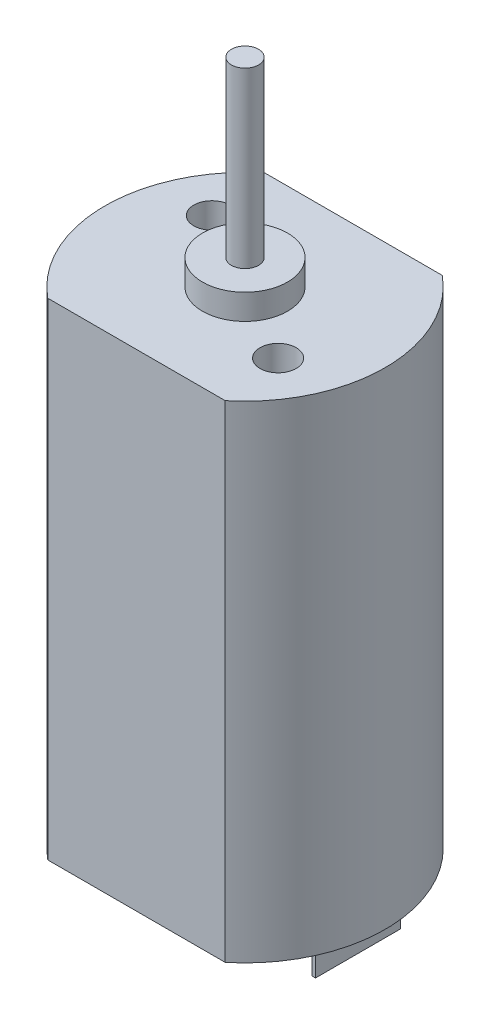
ISO-10303-21;
HEADER;
FILE_DESCRIPTION(('STEP AP214'),'2;1');
FILE_NAME('part.step','',(''),(''),'','','');
FILE_SCHEMA(('AUTOMOTIVE_DESIGN { 1 0 10303 214 1 1 1 1 }'));
ENDSEC;
DATA;
#1=APPLICATION_CONTEXT('core data for automotive mechanical design processes');
#2=APPLICATION_PROTOCOL_DEFINITION('international standard','automotive_design',2000,#1);
#3=PRODUCT_CONTEXT('',#1,'mechanical');
#4=PRODUCT('Part','Part','',(#3));
#5=PRODUCT_RELATED_PRODUCT_CATEGORY('part','',(#4));
#6=PRODUCT_DEFINITION_FORMATION('','',#4);
#7=PRODUCT_DEFINITION_CONTEXT('part definition',#1,'design');
#8=PRODUCT_DEFINITION('design','',#6,#7);
#9=PRODUCT_DEFINITION_SHAPE('','',#8);
#10=(LENGTH_UNIT() NAMED_UNIT(*) SI_UNIT(.MILLI.,.METRE.));
#11=(NAMED_UNIT(*) PLANE_ANGLE_UNIT() SI_UNIT($,.RADIAN.));
#12=(NAMED_UNIT(*) SI_UNIT($,.STERADIAN.) SOLID_ANGLE_UNIT());
#13=UNCERTAINTY_MEASURE_WITH_UNIT(LENGTH_MEASURE(1.E-05),#10,'distance_accuracy_value','');
#14=(GEOMETRIC_REPRESENTATION_CONTEXT(3) GLOBAL_UNCERTAINTY_ASSIGNED_CONTEXT((#13)) GLOBAL_UNIT_ASSIGNED_CONTEXT((#10,
#11,#12)) REPRESENTATION_CONTEXT('',''));
#15=CARTESIAN_POINT('',(0.,0.,0.));
#16=DIRECTION('',(0.,0.,1.));
#17=DIRECTION('',(1.,0.,0.));
#18=AXIS2_PLACEMENT_3D('',#15,#16,#17);
#19=CARTESIAN_POINT('',(0.,-13.45,0.));
#20=DIRECTION('',(0.,1.,0.));
#21=DIRECTION('',(0.,0.,1.));
#22=AXIS2_PLACEMENT_3D('',#19,#20,#21);
#23=PLANE('',#22);
#24=DIRECTION('',(0.,0.,-1.));
#25=VECTOR('',#24,1.);
#26=CARTESIAN_POINT('',(-6.25,-13.45,2.35));
#27=LINE('',#26,#25);
#28=CARTESIAN_POINT('',(-6.25,-13.45,2.35));
#29=VERTEX_POINT('',#28);
#30=CARTESIAN_POINT('',(-6.25,-13.45,-2.35));
#31=VERTEX_POINT('',#30);
#32=EDGE_CURVE('E142',#29,#31,#27,.T.);
#33=ORIENTED_EDGE('',*,*,#32,.F.);
#34=DIRECTION('',(-1.,0.,0.));
#35=VECTOR('',#34,1.);
#36=CARTESIAN_POINT('',(-6.25,-13.45,2.35));
#37=LINE('',#36,#35);
#38=CARTESIAN_POINT('',(-6.05,-13.45,2.35));
#39=VERTEX_POINT('',#38);
#40=EDGE_CURVE('E155',#39,#29,#37,.T.);
#41=ORIENTED_EDGE('',*,*,#40,.F.);
#42=DIRECTION('',(0.,0.,1.));
#43=VECTOR('',#42,1.);
#44=CARTESIAN_POINT('',(-6.05,-13.45,2.35));
#45=LINE('',#44,#43);
#46=CARTESIAN_POINT('',(-6.05,-13.45,-2.35));
#47=VERTEX_POINT('',#46);
#48=EDGE_CURVE('E164',#47,#39,#45,.T.);
#49=ORIENTED_EDGE('',*,*,#48,.F.);
#50=DIRECTION('',(1.,0.,0.));
#51=VECTOR('',#50,1.);
#52=CARTESIAN_POINT('',(-6.25,-13.45,-2.35));
#53=LINE('',#52,#51);
#54=EDGE_CURVE('E145',#31,#47,#53,.T.);
#55=ORIENTED_EDGE('',*,*,#54,.F.);
#56=EDGE_LOOP('',(#33,#41,#49,#55));
#57=FACE_BOUND('',#56,.T.);
#58=CARTESIAN_POINT('',(0.,-13.45,0.));
#59=DIRECTION('',(0.,1.,0.));
#60=DIRECTION('',(0.,0.,1.));
#61=AXIS2_PLACEMENT_3D('',#58,#59,#60);
#62=CIRCLE('',#61,7.75);
#63=CARTESIAN_POINT('',(4.90535421758714,-13.45,6.));
#64=VERTEX_POINT('',#63);
#65=CARTESIAN_POINT('',(4.90535421758714,-13.45,-6.));
#66=VERTEX_POINT('',#65);
#67=EDGE_CURVE('E190',#64,#66,#62,.T.);
#68=ORIENTED_EDGE('',*,*,#67,.F.);
#69=DIRECTION('',(1.,0.,0.));
#70=VECTOR('',#69,1.);
#71=CARTESIAN_POINT('',(4.90535421758714,-13.45,6.));
#72=LINE('',#71,#70);
#73=CARTESIAN_POINT('',(-4.90535421758714,-13.45,6.));
#74=VERTEX_POINT('',#73);
#75=EDGE_CURVE('E197',#74,#64,#72,.T.);
#76=ORIENTED_EDGE('',*,*,#75,.F.);
#77=CARTESIAN_POINT('',(0.,-13.45,0.));
#78=DIRECTION('',(0.,1.,0.));
#79=DIRECTION('',(0.,0.,1.));
#80=AXIS2_PLACEMENT_3D('',#77,#78,#79);
#81=CIRCLE('',#80,7.75);
#82=CARTESIAN_POINT('',(-4.90535421758714,-13.45,-6.));
#83=VERTEX_POINT('',#82);
#84=EDGE_CURVE('E208',#83,#74,#81,.T.);
#85=ORIENTED_EDGE('',*,*,#84,.F.);
#86=DIRECTION('',(-1.,0.,0.));
#87=VECTOR('',#86,1.);
#88=CARTESIAN_POINT('',(-4.90535421758714,-13.45,-6.));
#89=LINE('',#88,#87);
#90=EDGE_CURVE('E206',#66,#83,#89,.T.);
#91=ORIENTED_EDGE('',*,*,#90,.F.);
#92=EDGE_LOOP('',(#68,#76,#85,#91));
#93=FACE_BOUND('',#92,.T.);
#94=DIRECTION('',(0.,0.,-1.));
#95=VECTOR('',#94,1.);
#96=CARTESIAN_POINT('',(6.05,-13.45,2.35));
#97=LINE('',#96,#95);
#98=CARTESIAN_POINT('',(6.05,-13.45,2.35));
#99=VERTEX_POINT('',#98);
#100=CARTESIAN_POINT('',(6.05,-13.45,-2.35));
#101=VERTEX_POINT('',#100);
#102=EDGE_CURVE('E141',#99,#101,#97,.T.);
#103=ORIENTED_EDGE('',*,*,#102,.F.);
#104=DIRECTION('',(-1.,0.,0.));
#105=VECTOR('',#104,1.);
#106=CARTESIAN_POINT('',(6.05,-13.45,2.35));
#107=LINE('',#106,#105);
#108=CARTESIAN_POINT('',(6.25,-13.45,2.35));
#109=VERTEX_POINT('',#108);
#110=EDGE_CURVE('E138',#109,#99,#107,.T.);
#111=ORIENTED_EDGE('',*,*,#110,.F.);
#112=DIRECTION('',(0.,0.,1.));
#113=VECTOR('',#112,1.);
#114=CARTESIAN_POINT('',(6.25,-13.45,2.35));
#115=LINE('',#114,#113);
#116=CARTESIAN_POINT('',(6.25,-13.45,-2.35));
#117=VERTEX_POINT('',#116);
#118=EDGE_CURVE('E52',#117,#109,#115,.T.);
#119=ORIENTED_EDGE('',*,*,#118,.F.);
#120=DIRECTION('',(1.,0.,0.));
#121=VECTOR('',#120,1.);
#122=CARTESIAN_POINT('',(6.05,-13.45,-2.35));
#123=LINE('',#122,#121);
#124=EDGE_CURVE('E47',#101,#117,#123,.T.);
#125=ORIENTED_EDGE('',*,*,#124,.F.);
#126=EDGE_LOOP('',(#103,#111,#119,#125));
#127=FACE_BOUND('',#126,.T.);
#128=ADVANCED_FACE('F32',(#57,#93,#127),#23,.F.);
#129=CARTESIAN_POINT('',(0.,13.45,0.));
#130=DIRECTION('',(0.,-1.,0.));
#131=DIRECTION('',(0.,0.,-1.));
#132=AXIS2_PLACEMENT_3D('',#129,#130,#131);
#133=CYLINDRICAL_SURFACE('',#132,7.75);
#134=ORIENTED_EDGE('',*,*,#67,.T.);
#135=DIRECTION('',(0.,-1.,0.));
#136=VECTOR('',#135,1.);
#137=CARTESIAN_POINT('',(4.90535421758714,13.45,-6.));
#138=LINE('',#137,#136);
#139=CARTESIAN_POINT('',(4.90535421758714,13.45,-6.));
#140=VERTEX_POINT('',#139);
#141=EDGE_CURVE('E11',#140,#66,#138,.T.);
#142=ORIENTED_EDGE('',*,*,#141,.F.);
#143=CARTESIAN_POINT('',(0.,13.45,0.));
#144=DIRECTION('',(0.,1.,0.));
#145=DIRECTION('',(0.,0.,1.));
#146=AXIS2_PLACEMENT_3D('',#143,#144,#145);
#147=CIRCLE('',#146,7.75);
#148=CARTESIAN_POINT('',(4.90535421758714,13.45,6.));
#149=VERTEX_POINT('',#148);
#150=EDGE_CURVE('E193',#149,#140,#147,.T.);
#151=ORIENTED_EDGE('',*,*,#150,.F.);
#152=DIRECTION('',(0.,-1.,0.));
#153=VECTOR('',#152,1.);
#154=CARTESIAN_POINT('',(4.90535421758714,13.45,6.));
#155=LINE('',#154,#153);
#156=EDGE_CURVE('E203',#149,#64,#155,.T.);
#157=ORIENTED_EDGE('',*,*,#156,.T.);
#158=EDGE_LOOP('',(#134,#142,#151,#157));
#159=FACE_BOUND('',#158,.T.);
#160=ADVANCED_FACE('F34',(#159),#133,.T.);
#161=CARTESIAN_POINT('',(-4.90535421758714,13.45,-6.));
#162=DIRECTION('',(0.,0.,1.));
#163=DIRECTION('',(1.,0.,0.));
#164=AXIS2_PLACEMENT_3D('',#161,#162,#163);
#165=PLANE('',#164);
#166=ORIENTED_EDGE('',*,*,#90,.T.);
#167=DIRECTION('',(0.,-1.,0.));
#168=VECTOR('',#167,1.);
#169=CARTESIAN_POINT('',(-4.90535421758714,13.45,-6.));
#170=LINE('',#169,#168);
#171=CARTESIAN_POINT('',(-4.90535421758714,13.45,-6.));
#172=VERTEX_POINT('',#171);
#173=EDGE_CURVE('E40',#172,#83,#170,.T.);
#174=ORIENTED_EDGE('',*,*,#173,.F.);
#175=DIRECTION('',(-1.,0.,0.));
#176=VECTOR('',#175,1.);
#177=CARTESIAN_POINT('',(-4.90535421758714,13.45,-6.));
#178=LINE('',#177,#176);
#179=EDGE_CURVE('E196',#140,#172,#178,.T.);
#180=ORIENTED_EDGE('',*,*,#179,.F.);
#181=ORIENTED_EDGE('',*,*,#141,.T.);
#182=EDGE_LOOP('',(#166,#174,#180,#181));
#183=FACE_BOUND('',#182,.T.);
#184=ADVANCED_FACE('F235',(#183),#165,.F.);
#185=CARTESIAN_POINT('',(0.,13.45,0.));
#186=DIRECTION('',(0.,-1.,0.));
#187=DIRECTION('',(0.,0.,-1.));
#188=AXIS2_PLACEMENT_3D('',#185,#186,#187);
#189=CYLINDRICAL_SURFACE('',#188,7.75);
#190=ORIENTED_EDGE('',*,*,#84,.T.);
#191=DIRECTION('',(0.,-1.,0.));
#192=VECTOR('',#191,1.);
#193=CARTESIAN_POINT('',(-4.90535421758714,13.45,6.));
#194=LINE('',#193,#192);
#195=CARTESIAN_POINT('',(-4.90535421758714,13.45,6.));
#196=VERTEX_POINT('',#195);
#197=EDGE_CURVE('E213',#196,#74,#194,.T.);
#198=ORIENTED_EDGE('',*,*,#197,.F.);
#199=CARTESIAN_POINT('',(0.,13.45,0.));
#200=DIRECTION('',(0.,1.,0.));
#201=DIRECTION('',(0.,0.,1.));
#202=AXIS2_PLACEMENT_3D('',#199,#200,#201);
#203=CIRCLE('',#202,7.75);
#204=EDGE_CURVE('E199',#172,#196,#203,.T.);
#205=ORIENTED_EDGE('',*,*,#204,.F.);
#206=ORIENTED_EDGE('',*,*,#173,.T.);
#207=EDGE_LOOP('',(#190,#198,#205,#206));
#208=FACE_BOUND('',#207,.T.);
#209=ADVANCED_FACE('F220',(#208),#189,.T.);
#210=CARTESIAN_POINT('',(4.90535421758714,13.45,6.));
#211=DIRECTION('',(0.,0.,-1.));
#212=DIRECTION('',(-1.,0.,0.));
#213=AXIS2_PLACEMENT_3D('',#210,#211,#212);
#214=PLANE('',#213);
#215=ORIENTED_EDGE('',*,*,#75,.T.);
#216=ORIENTED_EDGE('',*,*,#156,.F.);
#217=DIRECTION('',(1.,0.,0.));
#218=VECTOR('',#217,1.);
#219=CARTESIAN_POINT('',(4.90535421758714,13.45,6.));
#220=LINE('',#219,#218);
#221=EDGE_CURVE('E201',#196,#149,#220,.T.);
#222=ORIENTED_EDGE('',*,*,#221,.F.);
#223=ORIENTED_EDGE('',*,*,#197,.T.);
#224=EDGE_LOOP('',(#215,#216,#222,#223));
#225=FACE_BOUND('',#224,.T.);
#226=ADVANCED_FACE('F228',(#225),#214,.F.);
#227=CARTESIAN_POINT('',(0.,13.45,0.));
#228=DIRECTION('',(0.,1.,0.));
#229=DIRECTION('',(0.,0.,1.));
#230=AXIS2_PLACEMENT_3D('',#227,#228,#229);
#231=PLANE('',#230);
#232=CARTESIAN_POINT('',(4.33012701892221,13.45,2.49999999999997));
#233=DIRECTION('',(0.,1.,0.));
#234=DIRECTION('',(0.,0.,1.));
#235=AXIS2_PLACEMENT_3D('',#232,#233,#234);
#236=CIRCLE('',#235,1.);
#237=CARTESIAN_POINT('',(4.33012701892221,13.45,3.49999999999997));
#238=VERTEX_POINT('',#237);
#239=EDGE_CURVE('E264',#238,#238,#236,.T.);
#240=ORIENTED_EDGE('',*,*,#239,.F.);
#241=EDGE_LOOP('',(#240));
#242=FACE_BOUND('',#241,.T.);
#243=CARTESIAN_POINT('',(-4.33012701892221,13.45,-2.49999999999997));
#244=DIRECTION('',(0.,1.,0.));
#245=DIRECTION('',(0.,0.,1.));
#246=AXIS2_PLACEMENT_3D('',#243,#244,#245);
#247=CIRCLE('',#246,1.);
#248=CARTESIAN_POINT('',(-4.33012701892221,13.45,-1.49999999999997));
#249=VERTEX_POINT('',#248);
#250=EDGE_CURVE('E268',#249,#249,#247,.T.);
#251=ORIENTED_EDGE('',*,*,#250,.F.);
#252=EDGE_LOOP('',(#251));
#253=FACE_BOUND('',#252,.T.);
#254=CARTESIAN_POINT('',(0.,13.45,0.));
#255=DIRECTION('',(0.,1.,0.));
#256=DIRECTION('',(0.,0.,1.));
#257=AXIS2_PLACEMENT_3D('',#254,#255,#256);
#258=CIRCLE('',#257,2.35);
#259=CARTESIAN_POINT('',(0.,13.45,2.35));
#260=VERTEX_POINT('',#259);
#261=EDGE_CURVE('E184',#260,#260,#258,.T.);
#262=ORIENTED_EDGE('',*,*,#261,.F.);
#263=EDGE_LOOP('',(#262));
#264=FACE_BOUND('',#263,.T.);
#265=ORIENTED_EDGE('',*,*,#150,.T.);
#266=ORIENTED_EDGE('',*,*,#179,.T.);
#267=ORIENTED_EDGE('',*,*,#204,.T.);
#268=ORIENTED_EDGE('',*,*,#221,.T.);
#269=EDGE_LOOP('',(#265,#266,#267,#268));
#270=FACE_BOUND('',#269,.T.);
#271=ADVANCED_FACE('F234',(#242,#253,#264,#270),#231,.T.);
#272=CARTESIAN_POINT('',(0.,14.85,0.));
#273=DIRECTION('',(0.,-1.,0.));
#274=DIRECTION('',(0.,0.,-1.));
#275=AXIS2_PLACEMENT_3D('',#272,#273,#274);
#276=CYLINDRICAL_SURFACE('',#275,2.35);
#277=CARTESIAN_POINT('',(0.,14.85,0.));
#278=DIRECTION('',(0.,1.,0.));
#279=DIRECTION('',(0.,0.,1.));
#280=AXIS2_PLACEMENT_3D('',#277,#278,#279);
#281=CIRCLE('',#280,2.35);
#282=CARTESIAN_POINT('',(0.,14.85,2.35));
#283=VERTEX_POINT('',#282);
#284=EDGE_CURVE('E187',#283,#283,#281,.T.);
#285=ORIENTED_EDGE('',*,*,#284,.F.);
#286=EDGE_LOOP('',(#285));
#287=FACE_BOUND('',#286,.T.);
#288=ORIENTED_EDGE('',*,*,#261,.T.);
#289=EDGE_LOOP('',(#288));
#290=FACE_BOUND('',#289,.T.);
#291=ADVANCED_FACE('F254',(#287,#290),#276,.T.);
#292=CARTESIAN_POINT('',(0.,14.85,0.));
#293=DIRECTION('',(0.,1.,0.));
#294=DIRECTION('',(0.,0.,1.));
#295=AXIS2_PLACEMENT_3D('',#292,#293,#294);
#296=PLANE('',#295);
#297=CARTESIAN_POINT('',(0.,14.85,0.));
#298=DIRECTION('',(0.,1.,0.));
#299=DIRECTION('',(0.,0.,1.));
#300=AXIS2_PLACEMENT_3D('',#297,#298,#299);
#301=CIRCLE('',#300,0.75);
#302=CARTESIAN_POINT('',(0.,14.85,0.75));
#303=VERTEX_POINT('',#302);
#304=EDGE_CURVE('E180',#303,#303,#301,.T.);
#305=ORIENTED_EDGE('',*,*,#304,.F.);
#306=EDGE_LOOP('',(#305));
#307=FACE_BOUND('',#306,.T.);
#308=ORIENTED_EDGE('',*,*,#284,.T.);
#309=EDGE_LOOP('',(#308));
#310=FACE_BOUND('',#309,.T.);
#311=ADVANCED_FACE('F259',(#307,#310),#296,.T.);
#312=CARTESIAN_POINT('',(0.,24.45,0.));
#313=DIRECTION('',(0.,-1.,0.));
#314=DIRECTION('',(0.,0.,-1.));
#315=AXIS2_PLACEMENT_3D('',#312,#313,#314);
#316=CYLINDRICAL_SURFACE('',#315,0.75);
#317=CARTESIAN_POINT('',(0.,24.45,0.));
#318=DIRECTION('',(0.,1.,0.));
#319=DIRECTION('',(0.,0.,1.));
#320=AXIS2_PLACEMENT_3D('',#317,#318,#319);
#321=CIRCLE('',#320,0.75);
#322=CARTESIAN_POINT('',(0.,24.45,0.75));
#323=VERTEX_POINT('',#322);
#324=EDGE_CURVE('E181',#323,#323,#321,.T.);
#325=ORIENTED_EDGE('',*,*,#324,.F.);
#326=EDGE_LOOP('',(#325));
#327=FACE_BOUND('',#326,.T.);
#328=ORIENTED_EDGE('',*,*,#304,.T.);
#329=EDGE_LOOP('',(#328));
#330=FACE_BOUND('',#329,.T.);
#331=ADVANCED_FACE('F330',(#327,#330),#316,.T.);
#332=CARTESIAN_POINT('',(0.,24.45,0.));
#333=DIRECTION('',(0.,1.,0.));
#334=DIRECTION('',(0.,0.,1.));
#335=AXIS2_PLACEMENT_3D('',#332,#333,#334);
#336=PLANE('',#335);
#337=ORIENTED_EDGE('',*,*,#324,.T.);
#338=EDGE_LOOP('',(#337));
#339=FACE_BOUND('',#338,.T.);
#340=ADVANCED_FACE('F326',(#339),#336,.T.);
#341=CARTESIAN_POINT('',(-6.25,-15.35,2.35));
#342=DIRECTION('',(1.,0.,0.));
#343=DIRECTION('',(0.,0.,-1.));
#344=AXIS2_PLACEMENT_3D('',#341,#342,#343);
#345=PLANE('',#344);
#346=ORIENTED_EDGE('',*,*,#32,.T.);
#347=DIRECTION('',(0.,1.,0.));
#348=VECTOR('',#347,1.);
#349=CARTESIAN_POINT('',(-6.25,-15.35,-2.35));
#350=LINE('',#349,#348);
#351=CARTESIAN_POINT('',(-6.25,-15.35,-2.35));
#352=VERTEX_POINT('',#351);
#353=EDGE_CURVE('E177',#352,#31,#350,.T.);
#354=ORIENTED_EDGE('',*,*,#353,.F.);
#355=DIRECTION('',(0.,0.,-1.));
#356=VECTOR('',#355,1.);
#357=CARTESIAN_POINT('',(-6.25,-15.35,2.35));
#358=LINE('',#357,#356);
#359=CARTESIAN_POINT('',(-6.25,-15.35,2.35));
#360=VERTEX_POINT('',#359);
#361=EDGE_CURVE('E151',#360,#352,#358,.T.);
#362=ORIENTED_EDGE('',*,*,#361,.F.);
#363=DIRECTION('',(0.,1.,0.));
#364=VECTOR('',#363,1.);
#365=CARTESIAN_POINT('',(-6.25,-15.35,2.35));
#366=LINE('',#365,#364);
#367=EDGE_CURVE('E160',#360,#29,#366,.T.);
#368=ORIENTED_EDGE('',*,*,#367,.T.);
#369=EDGE_LOOP('',(#346,#354,#362,#368));
#370=FACE_BOUND('',#369,.T.);
#371=ADVANCED_FACE('F322',(#370),#345,.F.);
#372=CARTESIAN_POINT('',(-6.25,-15.35,-2.35));
#373=DIRECTION('',(0.,0.,1.));
#374=DIRECTION('',(1.,0.,0.));
#375=AXIS2_PLACEMENT_3D('',#372,#373,#374);
#376=PLANE('',#375);
#377=ORIENTED_EDGE('',*,*,#54,.T.);
#378=DIRECTION('',(0.,1.,0.));
#379=VECTOR('',#378,1.);
#380=CARTESIAN_POINT('',(-6.05,-15.35,-2.35));
#381=LINE('',#380,#379);
#382=CARTESIAN_POINT('',(-6.05,-15.35,-2.35));
#383=VERTEX_POINT('',#382);
#384=EDGE_CURVE('E174',#383,#47,#381,.T.);
#385=ORIENTED_EDGE('',*,*,#384,.F.);
#386=DIRECTION('',(1.,0.,0.));
#387=VECTOR('',#386,1.);
#388=CARTESIAN_POINT('',(-6.25,-15.35,-2.35));
#389=LINE('',#388,#387);
#390=EDGE_CURVE('E154',#352,#383,#389,.T.);
#391=ORIENTED_EDGE('',*,*,#390,.F.);
#392=ORIENTED_EDGE('',*,*,#353,.T.);
#393=EDGE_LOOP('',(#377,#385,#391,#392));
#394=FACE_BOUND('',#393,.T.);
#395=ADVANCED_FACE('F318',(#394),#376,.F.);
#396=CARTESIAN_POINT('',(-6.05,-15.35,2.35));
#397=DIRECTION('',(-1.,0.,0.));
#398=DIRECTION('',(0.,0.,1.));
#399=AXIS2_PLACEMENT_3D('',#396,#397,#398);
#400=PLANE('',#399);
#401=ORIENTED_EDGE('',*,*,#48,.T.);
#402=DIRECTION('',(0.,1.,0.));
#403=VECTOR('',#402,1.);
#404=CARTESIAN_POINT('',(-6.05,-15.35,2.35));
#405=LINE('',#404,#403);
#406=CARTESIAN_POINT('',(-6.05,-15.35,2.35));
#407=VERTEX_POINT('',#406);
#408=EDGE_CURVE('E171',#407,#39,#405,.T.);
#409=ORIENTED_EDGE('',*,*,#408,.F.);
#410=DIRECTION('',(0.,0.,1.));
#411=VECTOR('',#410,1.);
#412=CARTESIAN_POINT('',(-6.05,-15.35,2.35));
#413=LINE('',#412,#411);
#414=EDGE_CURVE('E157',#383,#407,#413,.T.);
#415=ORIENTED_EDGE('',*,*,#414,.F.);
#416=ORIENTED_EDGE('',*,*,#384,.T.);
#417=EDGE_LOOP('',(#401,#409,#415,#416));
#418=FACE_BOUND('',#417,.T.);
#419=ADVANCED_FACE('F314',(#418),#400,.F.);
#420=CARTESIAN_POINT('',(-6.25,-15.35,2.35));
#421=DIRECTION('',(0.,0.,-1.));
#422=DIRECTION('',(-1.,0.,0.));
#423=AXIS2_PLACEMENT_3D('',#420,#421,#422);
#424=PLANE('',#423);
#425=ORIENTED_EDGE('',*,*,#40,.T.);
#426=ORIENTED_EDGE('',*,*,#367,.F.);
#427=DIRECTION('',(-1.,0.,0.));
#428=VECTOR('',#427,1.);
#429=CARTESIAN_POINT('',(-6.25,-15.35,2.35));
#430=LINE('',#429,#428);
#431=EDGE_CURVE('E159',#407,#360,#430,.T.);
#432=ORIENTED_EDGE('',*,*,#431,.F.);
#433=ORIENTED_EDGE('',*,*,#408,.T.);
#434=EDGE_LOOP('',(#425,#426,#432,#433));
#435=FACE_BOUND('',#434,.T.);
#436=ADVANCED_FACE('F310',(#435),#424,.F.);
#437=CARTESIAN_POINT('',(0.,-15.35,0.));
#438=DIRECTION('',(0.,-1.,0.));
#439=DIRECTION('',(0.,0.,-1.));
#440=AXIS2_PLACEMENT_3D('',#437,#438,#439);
#441=PLANE('',#440);
#442=ORIENTED_EDGE('',*,*,#361,.T.);
#443=ORIENTED_EDGE('',*,*,#390,.T.);
#444=ORIENTED_EDGE('',*,*,#414,.T.);
#445=ORIENTED_EDGE('',*,*,#431,.T.);
#446=EDGE_LOOP('',(#442,#443,#444,#445));
#447=FACE_BOUND('',#446,.T.);
#448=ADVANCED_FACE('F307',(#447),#441,.T.);
#449=CARTESIAN_POINT('',(6.05,-15.35,2.35));
#450=DIRECTION('',(1.,0.,0.));
#451=DIRECTION('',(0.,0.,-1.));
#452=AXIS2_PLACEMENT_3D('',#449,#450,#451);
#453=PLANE('',#452);
#454=ORIENTED_EDGE('',*,*,#102,.T.);
#455=DIRECTION('',(0.,1.,0.));
#456=VECTOR('',#455,1.);
#457=CARTESIAN_POINT('',(6.05,-15.35,-2.35));
#458=LINE('',#457,#456);
#459=CARTESIAN_POINT('',(6.05,-15.35,-2.35));
#460=VERTEX_POINT('',#459);
#461=EDGE_CURVE('E122',#460,#101,#458,.T.);
#462=ORIENTED_EDGE('',*,*,#461,.F.);
#463=DIRECTION('',(0.,0.,-1.));
#464=VECTOR('',#463,1.);
#465=CARTESIAN_POINT('',(6.05,-15.35,2.35));
#466=LINE('',#465,#464);
#467=CARTESIAN_POINT('',(6.05,-15.35,2.35));
#468=VERTEX_POINT('',#467);
#469=EDGE_CURVE('E129',#468,#460,#466,.T.);
#470=ORIENTED_EDGE('',*,*,#469,.F.);
#471=DIRECTION('',(0.,1.,0.));
#472=VECTOR('',#471,1.);
#473=CARTESIAN_POINT('',(6.05,-15.35,2.35));
#474=LINE('',#473,#472);
#475=EDGE_CURVE('E283',#468,#99,#474,.T.);
#476=ORIENTED_EDGE('',*,*,#475,.T.);
#477=EDGE_LOOP('',(#454,#462,#470,#476));
#478=FACE_BOUND('',#477,.T.);
#479=ADVANCED_FACE('F140',(#478),#453,.F.);
#480=CARTESIAN_POINT('',(6.05,-15.35,-2.35));
#481=DIRECTION('',(0.,0.,1.));
#482=DIRECTION('',(1.,0.,0.));
#483=AXIS2_PLACEMENT_3D('',#480,#481,#482);
#484=PLANE('',#483);
#485=ORIENTED_EDGE('',*,*,#124,.T.);
#486=DIRECTION('',(0.,1.,0.));
#487=VECTOR('',#486,1.);
#488=CARTESIAN_POINT('',(6.25,-15.35,-2.35));
#489=LINE('',#488,#487);
#490=CARTESIAN_POINT('',(6.25,-15.35,-2.35));
#491=VERTEX_POINT('',#490);
#492=EDGE_CURVE('E125',#491,#117,#489,.T.);
#493=ORIENTED_EDGE('',*,*,#492,.F.);
#494=DIRECTION('',(1.,0.,0.));
#495=VECTOR('',#494,1.);
#496=CARTESIAN_POINT('',(6.05,-15.35,-2.35));
#497=LINE('',#496,#495);
#498=EDGE_CURVE('E118',#460,#491,#497,.T.);
#499=ORIENTED_EDGE('',*,*,#498,.F.);
#500=ORIENTED_EDGE('',*,*,#461,.T.);
#501=EDGE_LOOP('',(#485,#493,#499,#500));
#502=FACE_BOUND('',#501,.T.);
#503=ADVANCED_FACE('F120',(#502),#484,.F.);
#504=CARTESIAN_POINT('',(6.25,-15.35,2.35));
#505=DIRECTION('',(-1.,0.,0.));
#506=DIRECTION('',(0.,0.,1.));
#507=AXIS2_PLACEMENT_3D('',#504,#505,#506);
#508=PLANE('',#507);
#509=ORIENTED_EDGE('',*,*,#118,.T.);
#510=DIRECTION('',(0.,1.,0.));
#511=VECTOR('',#510,1.);
#512=CARTESIAN_POINT('',(6.25,-15.35,2.35));
#513=LINE('',#512,#511);
#514=CARTESIAN_POINT('',(6.25,-15.35,2.35));
#515=VERTEX_POINT('',#514);
#516=EDGE_CURVE('E147',#515,#109,#513,.T.);
#517=ORIENTED_EDGE('',*,*,#516,.F.);
#518=DIRECTION('',(0.,0.,1.));
#519=VECTOR('',#518,1.);
#520=CARTESIAN_POINT('',(6.25,-15.35,2.35));
#521=LINE('',#520,#519);
#522=EDGE_CURVE('E128',#491,#515,#521,.T.);
#523=ORIENTED_EDGE('',*,*,#522,.F.);
#524=ORIENTED_EDGE('',*,*,#492,.T.);
#525=EDGE_LOOP('',(#509,#517,#523,#524));
#526=FACE_BOUND('',#525,.T.);
#527=ADVANCED_FACE('F294',(#526),#508,.F.);
#528=CARTESIAN_POINT('',(6.05,-15.35,2.35));
#529=DIRECTION('',(0.,0.,-1.));
#530=DIRECTION('',(-1.,0.,0.));
#531=AXIS2_PLACEMENT_3D('',#528,#529,#530);
#532=PLANE('',#531);
#533=ORIENTED_EDGE('',*,*,#110,.T.);
#534=ORIENTED_EDGE('',*,*,#475,.F.);
#535=DIRECTION('',(-1.,0.,0.));
#536=VECTOR('',#535,1.);
#537=CARTESIAN_POINT('',(6.05,-15.35,2.35));
#538=LINE('',#537,#536);
#539=EDGE_CURVE('E134',#515,#468,#538,.T.);
#540=ORIENTED_EDGE('',*,*,#539,.F.);
#541=ORIENTED_EDGE('',*,*,#516,.T.);
#542=EDGE_LOOP('',(#533,#534,#540,#541));
#543=FACE_BOUND('',#542,.T.);
#544=ADVANCED_FACE('F292',(#543),#532,.F.);
#545=CARTESIAN_POINT('',(0.,-15.35,0.));
#546=DIRECTION('',(0.,-1.,0.));
#547=DIRECTION('',(0.,0.,-1.));
#548=AXIS2_PLACEMENT_3D('',#545,#546,#547);
#549=PLANE('',#548);
#550=ORIENTED_EDGE('',*,*,#469,.T.);
#551=ORIENTED_EDGE('',*,*,#498,.T.);
#552=ORIENTED_EDGE('',*,*,#522,.T.);
#553=ORIENTED_EDGE('',*,*,#539,.T.);
#554=EDGE_LOOP('',(#550,#551,#552,#553));
#555=FACE_BOUND('',#554,.T.);
#556=ADVANCED_FACE('F132',(#555),#549,.T.);
#557=CARTESIAN_POINT('',(-4.33012701892221,11.55,-2.49999999999997));
#558=DIRECTION('',(0.,1.,0.));
#559=DIRECTION('',(0.,0.,1.));
#560=AXIS2_PLACEMENT_3D('',#557,#558,#559);
#561=CYLINDRICAL_SURFACE('',#560,1.);
#562=CARTESIAN_POINT('',(-4.33012701892221,11.55,-2.49999999999997));
#563=DIRECTION('',(0.,1.,0.));
#564=DIRECTION('',(0.,0.,1.));
#565=AXIS2_PLACEMENT_3D('',#562,#563,#564);
#566=CIRCLE('',#565,1.);
#567=CARTESIAN_POINT('',(-4.33012701892221,11.55,-1.49999999999997));
#568=VERTEX_POINT('',#567);
#569=EDGE_CURVE('E272',#568,#568,#566,.T.);
#570=CARTESIAN_POINT('',(-4.33012701892221,11.55,-1.49999999999997));
#571=CARTESIAN_POINT('',(-4.33012701892221,11.5697916666667,-1.49999999999997));
#572=CARTESIAN_POINT('',(-4.33012701892221,11.5895833333333,-1.49999999999997));
#573=CARTESIAN_POINT('',(-4.33012701892221,11.6291666666667,-1.49999999999997));
#574=CARTESIAN_POINT('',(-4.33012701892221,11.6489583333333,-1.49999999999997));
#575=CARTESIAN_POINT('',(-4.33012701892221,11.6885416666667,-1.49999999999997));
#576=CARTESIAN_POINT('',(-4.33012701892221,11.7083333333333,-1.49999999999997));
#577=CARTESIAN_POINT('',(-4.33012701892221,11.7479166666667,-1.49999999999997));
#578=CARTESIAN_POINT('',(-4.33012701892221,11.7677083333333,-1.49999999999997));
#579=CARTESIAN_POINT('',(-4.33012701892221,11.8072916666667,-1.49999999999997));
#580=CARTESIAN_POINT('',(-4.33012701892221,11.8270833333333,-1.49999999999997));
#581=CARTESIAN_POINT('',(-4.33012701892221,11.8666666666667,-1.49999999999997));
#582=CARTESIAN_POINT('',(-4.33012701892221,11.8864583333333,-1.49999999999997));
#583=CARTESIAN_POINT('',(-4.33012701892221,11.9260416666667,-1.49999999999997));
#584=CARTESIAN_POINT('',(-4.33012701892221,11.9458333333333,-1.49999999999997));
#585=CARTESIAN_POINT('',(-4.33012701892221,11.9854166666667,-1.49999999999997));
#586=CARTESIAN_POINT('',(-4.33012701892221,12.0052083333333,-1.49999999999997));
#587=CARTESIAN_POINT('',(-4.33012701892221,12.0447916666667,-1.49999999999997));
#588=CARTESIAN_POINT('',(-4.33012701892221,12.0645833333333,-1.49999999999997));
#589=CARTESIAN_POINT('',(-4.33012701892221,12.1041666666667,-1.49999999999997));
#590=CARTESIAN_POINT('',(-4.33012701892221,12.1239583333333,-1.49999999999997));
#591=CARTESIAN_POINT('',(-4.33012701892221,12.1635416666667,-1.49999999999997));
#592=CARTESIAN_POINT('',(-4.33012701892221,12.1833333333333,-1.49999999999997));
#593=CARTESIAN_POINT('',(-4.33012701892221,12.2229166666667,-1.49999999999997));
#594=CARTESIAN_POINT('',(-4.33012701892221,12.2427083333333,-1.49999999999997));
#595=CARTESIAN_POINT('',(-4.33012701892221,12.2822916666667,-1.49999999999997));
#596=CARTESIAN_POINT('',(-4.33012701892221,12.3020833333333,-1.49999999999997));
#597=CARTESIAN_POINT('',(-4.33012701892221,12.3416666666667,-1.49999999999997));
#598=CARTESIAN_POINT('',(-4.33012701892221,12.3614583333333,-1.49999999999997));
#599=CARTESIAN_POINT('',(-4.33012701892221,12.4010416666667,-1.49999999999997));
#600=CARTESIAN_POINT('',(-4.33012701892221,12.4208333333333,-1.49999999999997));
#601=CARTESIAN_POINT('',(-4.33012701892221,12.4604166666667,-1.49999999999997));
#602=CARTESIAN_POINT('',(-4.33012701892221,12.4802083333333,-1.49999999999997));
#603=CARTESIAN_POINT('',(-4.33012701892221,12.5197916666667,-1.49999999999997));
#604=CARTESIAN_POINT('',(-4.33012701892221,12.5395833333333,-1.49999999999997));
#605=CARTESIAN_POINT('',(-4.33012701892221,12.5791666666667,-1.49999999999997));
#606=CARTESIAN_POINT('',(-4.33012701892221,12.5989583333333,-1.49999999999997));
#607=CARTESIAN_POINT('',(-4.33012701892221,12.6385416666667,-1.49999999999997));
#608=CARTESIAN_POINT('',(-4.33012701892221,12.6583333333333,-1.49999999999997));
#609=CARTESIAN_POINT('',(-4.33012701892221,12.6979166666667,-1.49999999999997));
#610=CARTESIAN_POINT('',(-4.33012701892221,12.7177083333333,-1.49999999999997));
#611=CARTESIAN_POINT('',(-4.33012701892221,12.7572916666667,-1.49999999999997));
#612=CARTESIAN_POINT('',(-4.33012701892221,12.7770833333333,-1.49999999999997));
#613=CARTESIAN_POINT('',(-4.33012701892221,12.8166666666667,-1.49999999999997));
#614=CARTESIAN_POINT('',(-4.33012701892221,12.8364583333333,-1.49999999999997));
#615=CARTESIAN_POINT('',(-4.33012701892221,12.8760416666667,-1.49999999999997));
#616=CARTESIAN_POINT('',(-4.33012701892221,12.8958333333333,-1.49999999999997));
#617=CARTESIAN_POINT('',(-4.33012701892221,12.9354166666667,-1.49999999999997));
#618=CARTESIAN_POINT('',(-4.33012701892221,12.9552083333333,-1.49999999999997));
#619=CARTESIAN_POINT('',(-4.33012701892221,12.9947916666667,-1.49999999999997));
#620=CARTESIAN_POINT('',(-4.33012701892221,13.0145833333333,-1.49999999999997));
#621=CARTESIAN_POINT('',(-4.33012701892221,13.0541666666667,-1.49999999999997));
#622=CARTESIAN_POINT('',(-4.33012701892221,13.0739583333333,-1.49999999999997));
#623=CARTESIAN_POINT('',(-4.33012701892221,13.1135416666667,-1.49999999999997));
#624=CARTESIAN_POINT('',(-4.33012701892221,13.1333333333333,-1.49999999999997));
#625=CARTESIAN_POINT('',(-4.33012701892221,13.1729166666667,-1.49999999999997));
#626=CARTESIAN_POINT('',(-4.33012701892221,13.1927083333333,-1.49999999999997));
#627=CARTESIAN_POINT('',(-4.33012701892221,13.2322916666667,-1.49999999999997));
#628=CARTESIAN_POINT('',(-4.33012701892221,13.2520833333333,-1.49999999999997));
#629=CARTESIAN_POINT('',(-4.33012701892221,13.2916666666667,-1.49999999999997));
#630=CARTESIAN_POINT('',(-4.33012701892221,13.3114583333333,-1.49999999999997));
#631=CARTESIAN_POINT('',(-4.33012701892221,13.3510416666667,-1.49999999999997));
#632=CARTESIAN_POINT('',(-4.33012701892221,13.3708333333333,-1.49999999999997));
#633=CARTESIAN_POINT('',(-4.33012701892221,13.4104166666667,-1.49999999999997));
#634=CARTESIAN_POINT('',(-4.33012701892221,13.4302083333333,-1.49999999999997));
#635=CARTESIAN_POINT('',(-4.33012701892221,13.45,-1.49999999999997));
#636=B_SPLINE_CURVE_WITH_KNOTS('',3,(#570,#571,#572,#573,#574,#575,#576,#577,#578,#579,#580,
#581,#582,#583,#584,#585,#586,#587,#588,#589,#590,#591,#592,#593,#594,#595,#596,#597,#598,#599,
#600,#601,#602,#603,#604,#605,#606,#607,#608,#609,#610,#611,#612,#613,#614,#615,#616,#617,#618,
#619,#620,#621,#622,#623,#624,#625,#626,#627,#628,#629,#630,#631,#632,#633,#634,#635),
.UNSPECIFIED.,.F.,.F.,(4,2,2,2,2,2,2,2,2,2,2,2,2,2,2,2,2,2,2,2,2,2,2,2,2,2,2,2,2,2,2,2,4),(0.,
0.0593749999999987,0.118749999999999,0.178124999999999,0.2375,0.296874999999999,
0.356249999999999,0.415624999999999,0.475,0.534374999999998,0.593749999999999,0.653124999999999,
0.7125,0.771875,0.831249999999999,0.890624999999999,0.95,1.009375,1.06875,1.128125,1.1875,
1.246875,1.30625,1.365625,1.425,1.484375,1.54375,1.603125,1.6625,1.721875,1.78125,1.840625,1.9),.UNSPECIFIED.);
#637=EDGE_CURVE('BSEAM399',#568,#249,#636,.T.);
#638=ORIENTED_EDGE('',*,*,#569,.F.);
#639=ORIENTED_EDGE('',*,*,#250,.T.);
#640=ORIENTED_EDGE('',*,*,#637,.T.);
#641=ORIENTED_EDGE('',*,*,#637,.F.);
#642=EDGE_LOOP('',(#638,#640,#639,#641));
#643=FACE_BOUND('',#642,.T.);
#644=ADVANCED_FACE('F399',(#643),#561,.F.);
#645=CARTESIAN_POINT('',(-4.33012701892221,11.55,-2.49999999999997));
#646=DIRECTION('',(0.,1.,0.));
#647=DIRECTION('',(0.,0.,1.));
#648=AXIS2_PLACEMENT_3D('',#645,#646,#647);
#649=PLANE('',#648);
#650=ORIENTED_EDGE('',*,*,#569,.T.);
#651=EDGE_LOOP('',(#650));
#652=FACE_BOUND('',#651,.T.);
#653=ADVANCED_FACE('F414',(#652),#649,.T.);
#654=CARTESIAN_POINT('',(4.33012701892221,11.55,2.49999999999997));
#655=DIRECTION('',(0.,1.,0.));
#656=DIRECTION('',(0.,0.,1.));
#657=AXIS2_PLACEMENT_3D('',#654,#655,#656);
#658=CYLINDRICAL_SURFACE('',#657,1.);
#659=CARTESIAN_POINT('',(4.33012701892221,11.55,2.49999999999997));
#660=DIRECTION('',(0.,1.,0.));
#661=DIRECTION('',(0.,0.,1.));
#662=AXIS2_PLACEMENT_3D('',#659,#660,#661);
#663=CIRCLE('',#662,1.);
#664=CARTESIAN_POINT('',(4.33012701892221,11.55,3.49999999999997));
#665=VERTEX_POINT('',#664);
#666=EDGE_CURVE('E273',#665,#665,#663,.T.);
#667=CARTESIAN_POINT('',(4.33012701892221,11.55,3.49999999999997));
#668=CARTESIAN_POINT('',(4.33012701892221,11.5697916666667,3.49999999999997));
#669=CARTESIAN_POINT('',(4.33012701892221,11.5895833333333,3.49999999999997));
#670=CARTESIAN_POINT('',(4.33012701892221,11.6291666666667,3.49999999999997));
#671=CARTESIAN_POINT('',(4.33012701892221,11.6489583333333,3.49999999999997));
#672=CARTESIAN_POINT('',(4.33012701892221,11.6885416666667,3.49999999999997));
#673=CARTESIAN_POINT('',(4.33012701892221,11.7083333333333,3.49999999999997));
#674=CARTESIAN_POINT('',(4.33012701892221,11.7479166666667,3.49999999999997));
#675=CARTESIAN_POINT('',(4.33012701892221,11.7677083333333,3.49999999999997));
#676=CARTESIAN_POINT('',(4.33012701892221,11.8072916666667,3.49999999999997));
#677=CARTESIAN_POINT('',(4.33012701892221,11.8270833333333,3.49999999999997));
#678=CARTESIAN_POINT('',(4.33012701892221,11.8666666666667,3.49999999999997));
#679=CARTESIAN_POINT('',(4.33012701892221,11.8864583333333,3.49999999999997));
#680=CARTESIAN_POINT('',(4.33012701892221,11.9260416666667,3.49999999999997));
#681=CARTESIAN_POINT('',(4.33012701892221,11.9458333333333,3.49999999999997));
#682=CARTESIAN_POINT('',(4.33012701892221,11.9854166666667,3.49999999999997));
#683=CARTESIAN_POINT('',(4.33012701892221,12.0052083333333,3.49999999999997));
#684=CARTESIAN_POINT('',(4.33012701892221,12.0447916666667,3.49999999999997));
#685=CARTESIAN_POINT('',(4.33012701892221,12.0645833333333,3.49999999999997));
#686=CARTESIAN_POINT('',(4.33012701892221,12.1041666666667,3.49999999999997));
#687=CARTESIAN_POINT('',(4.33012701892221,12.1239583333333,3.49999999999997));
#688=CARTESIAN_POINT('',(4.33012701892221,12.1635416666667,3.49999999999997));
#689=CARTESIAN_POINT('',(4.33012701892221,12.1833333333333,3.49999999999997));
#690=CARTESIAN_POINT('',(4.33012701892221,12.2229166666667,3.49999999999997));
#691=CARTESIAN_POINT('',(4.33012701892221,12.2427083333333,3.49999999999997));
#692=CARTESIAN_POINT('',(4.33012701892221,12.2822916666667,3.49999999999997));
#693=CARTESIAN_POINT('',(4.33012701892221,12.3020833333333,3.49999999999997));
#694=CARTESIAN_POINT('',(4.33012701892221,12.3416666666667,3.49999999999997));
#695=CARTESIAN_POINT('',(4.33012701892221,12.3614583333333,3.49999999999997));
#696=CARTESIAN_POINT('',(4.33012701892221,12.4010416666667,3.49999999999997));
#697=CARTESIAN_POINT('',(4.33012701892221,12.4208333333333,3.49999999999997));
#698=CARTESIAN_POINT('',(4.33012701892221,12.4604166666667,3.49999999999997));
#699=CARTESIAN_POINT('',(4.33012701892221,12.4802083333333,3.49999999999997));
#700=CARTESIAN_POINT('',(4.33012701892221,12.5197916666667,3.49999999999997));
#701=CARTESIAN_POINT('',(4.33012701892221,12.5395833333333,3.49999999999997));
#702=CARTESIAN_POINT('',(4.33012701892221,12.5791666666667,3.49999999999997));
#703=CARTESIAN_POINT('',(4.33012701892221,12.5989583333333,3.49999999999997));
#704=CARTESIAN_POINT('',(4.33012701892221,12.6385416666667,3.49999999999997));
#705=CARTESIAN_POINT('',(4.33012701892221,12.6583333333333,3.49999999999997));
#706=CARTESIAN_POINT('',(4.33012701892221,12.6979166666667,3.49999999999997));
#707=CARTESIAN_POINT('',(4.33012701892221,12.7177083333333,3.49999999999997));
#708=CARTESIAN_POINT('',(4.33012701892221,12.7572916666667,3.49999999999997));
#709=CARTESIAN_POINT('',(4.33012701892221,12.7770833333333,3.49999999999997));
#710=CARTESIAN_POINT('',(4.33012701892221,12.8166666666667,3.49999999999997));
#711=CARTESIAN_POINT('',(4.33012701892221,12.8364583333333,3.49999999999997));
#712=CARTESIAN_POINT('',(4.33012701892221,12.8760416666667,3.49999999999997));
#713=CARTESIAN_POINT('',(4.33012701892221,12.8958333333333,3.49999999999997));
#714=CARTESIAN_POINT('',(4.33012701892221,12.9354166666667,3.49999999999997));
#715=CARTESIAN_POINT('',(4.33012701892221,12.9552083333333,3.49999999999997));
#716=CARTESIAN_POINT('',(4.33012701892221,12.9947916666667,3.49999999999997));
#717=CARTESIAN_POINT('',(4.33012701892221,13.0145833333333,3.49999999999997));
#718=CARTESIAN_POINT('',(4.33012701892221,13.0541666666667,3.49999999999997));
#719=CARTESIAN_POINT('',(4.33012701892221,13.0739583333333,3.49999999999997));
#720=CARTESIAN_POINT('',(4.33012701892221,13.1135416666667,3.49999999999997));
#721=CARTESIAN_POINT('',(4.33012701892221,13.1333333333333,3.49999999999997));
#722=CARTESIAN_POINT('',(4.33012701892221,13.1729166666667,3.49999999999997));
#723=CARTESIAN_POINT('',(4.33012701892221,13.1927083333333,3.49999999999997));
#724=CARTESIAN_POINT('',(4.33012701892221,13.2322916666667,3.49999999999997));
#725=CARTESIAN_POINT('',(4.33012701892221,13.2520833333333,3.49999999999997));
#726=CARTESIAN_POINT('',(4.33012701892221,13.2916666666667,3.49999999999997));
#727=CARTESIAN_POINT('',(4.33012701892221,13.3114583333333,3.49999999999997));
#728=CARTESIAN_POINT('',(4.33012701892221,13.3510416666667,3.49999999999997));
#729=CARTESIAN_POINT('',(4.33012701892221,13.3708333333333,3.49999999999997));
#730=CARTESIAN_POINT('',(4.33012701892221,13.4104166666667,3.49999999999997));
#731=CARTESIAN_POINT('',(4.33012701892221,13.4302083333333,3.49999999999997));
#732=CARTESIAN_POINT('',(4.33012701892221,13.45,3.49999999999997));
#733=B_SPLINE_CURVE_WITH_KNOTS('',3,(#667,#668,#669,#670,#671,#672,#673,#674,#675,#676,#677,
#678,#679,#680,#681,#682,#683,#684,#685,#686,#687,#688,#689,#690,#691,#692,#693,#694,#695,#696,
#697,#698,#699,#700,#701,#702,#703,#704,#705,#706,#707,#708,#709,#710,#711,#712,#713,#714,#715,
#716,#717,#718,#719,#720,#721,#722,#723,#724,#725,#726,#727,#728,#729,#730,#731,#732),
.UNSPECIFIED.,.F.,.F.,(4,2,2,2,2,2,2,2,2,2,2,2,2,2,2,2,2,2,2,2,2,2,2,2,2,2,2,2,2,2,2,2,4),(0.,
0.0593749999999987,0.118749999999999,0.178124999999999,0.2375,0.296874999999999,
0.356249999999999,0.415624999999999,0.475,0.534374999999998,0.593749999999999,0.653124999999999,
0.7125,0.771875,0.831249999999999,0.890624999999999,0.95,1.009375,1.06875,1.128125,1.1875,
1.246875,1.30625,1.365625,1.425,1.484375,1.54375,1.603125,1.6625,1.721875,1.78125,1.840625,1.9),.UNSPECIFIED.);
#734=EDGE_CURVE('BSEAM424',#665,#238,#733,.T.);
#735=ORIENTED_EDGE('',*,*,#666,.F.);
#736=ORIENTED_EDGE('',*,*,#239,.T.);
#737=ORIENTED_EDGE('',*,*,#734,.T.);
#738=ORIENTED_EDGE('',*,*,#734,.F.);
#739=EDGE_LOOP('',(#735,#737,#736,#738));
#740=FACE_BOUND('',#739,.T.);
#741=ADVANCED_FACE('F424',(#740),#658,.F.);
#742=CARTESIAN_POINT('',(4.33012701892221,11.55,2.49999999999997));
#743=DIRECTION('',(0.,1.,0.));
#744=DIRECTION('',(0.,0.,1.));
#745=AXIS2_PLACEMENT_3D('',#742,#743,#744);
#746=PLANE('',#745);
#747=ORIENTED_EDGE('',*,*,#666,.T.);
#748=EDGE_LOOP('',(#747));
#749=FACE_BOUND('',#748,.T.);
#750=ADVANCED_FACE('F434',(#749),#746,.T.);
#751=CLOSED_SHELL('',(#128,#160,#184,#209,#226,#271,#291,#311,#331,#340,#371,#395,#419,#436,
#448,#479,#503,#527,#544,#556,#644,#653,#741,#750));
#752=MANIFOLD_SOLID_BREP('B2',#751);
#753=ADVANCED_BREP_SHAPE_REPRESENTATION('',(#18,#752),#14);
#754=SHAPE_DEFINITION_REPRESENTATION(#9,#753);
ENDSEC;
END-ISO-10303-21;
